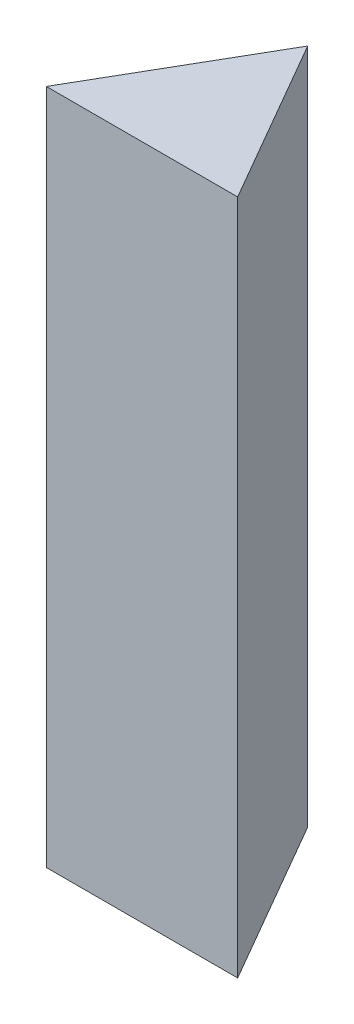
ISO-10303-21;
HEADER;
FILE_DESCRIPTION(('STEP AP214'),'2;1');
FILE_NAME('part.step','',(''),(''),'','','');
FILE_SCHEMA(('AUTOMOTIVE_DESIGN { 1 0 10303 214 1 1 1 1 }'));
ENDSEC;
DATA;
#1=APPLICATION_CONTEXT('core data for automotive mechanical design processes');
#2=APPLICATION_PROTOCOL_DEFINITION('international standard','automotive_design',2000,#1);
#3=PRODUCT_CONTEXT('',#1,'mechanical');
#4=PRODUCT('Part','Part','',(#3));
#5=PRODUCT_RELATED_PRODUCT_CATEGORY('part','',(#4));
#6=PRODUCT_DEFINITION_FORMATION('','',#4);
#7=PRODUCT_DEFINITION_CONTEXT('part definition',#1,'design');
#8=PRODUCT_DEFINITION('design','',#6,#7);
#9=PRODUCT_DEFINITION_SHAPE('','',#8);
#10=(LENGTH_UNIT() NAMED_UNIT(*) SI_UNIT(.MILLI.,.METRE.));
#11=(NAMED_UNIT(*) PLANE_ANGLE_UNIT() SI_UNIT($,.RADIAN.));
#12=(NAMED_UNIT(*) SI_UNIT($,.STERADIAN.) SOLID_ANGLE_UNIT());
#13=UNCERTAINTY_MEASURE_WITH_UNIT(LENGTH_MEASURE(1.E-05),#10,'distance_accuracy_value','');
#14=(GEOMETRIC_REPRESENTATION_CONTEXT(3) GLOBAL_UNCERTAINTY_ASSIGNED_CONTEXT((#13)) GLOBAL_UNIT_ASSIGNED_CONTEXT((#10,
#11,#12)) REPRESENTATION_CONTEXT('',''));
#15=CARTESIAN_POINT('',(0.,0.,0.));
#16=DIRECTION('',(0.,0.,1.));
#17=DIRECTION('',(1.,0.,0.));
#18=AXIS2_PLACEMENT_3D('',#15,#16,#17);
#19=CARTESIAN_POINT('',(0.,15.,1.22499999999998));
#20=DIRECTION('',(0.,0.,-1.));
#21=DIRECTION('',(-1.,0.,0.));
#22=AXIS2_PLACEMENT_3D('',#19,#20,#21);
#23=PLANE('',#22);
#24=DIRECTION('',(1.,0.,0.));
#25=VECTOR('',#24,1.);
#26=CARTESIAN_POINT('',(0.,0.,1.22499999999998));
#27=LINE('',#26,#25);
#28=CARTESIAN_POINT('',(-2.12176223927189,0.,1.22499999999998));
#29=VERTEX_POINT('',#28);
#30=CARTESIAN_POINT('',(2.12176223927189,0.,1.22499999999998));
#31=VERTEX_POINT('',#30);
#32=EDGE_CURVE('E82',#29,#31,#27,.T.);
#33=ORIENTED_EDGE('',*,*,#32,.T.);
#34=DIRECTION('',(0.,-1.,0.));
#35=VECTOR('',#34,1.);
#36=CARTESIAN_POINT('',(2.12176223927189,15.,1.22499999999998));
#37=LINE('',#36,#35);
#38=CARTESIAN_POINT('',(2.12176223927189,15.,1.22499999999998));
#39=VERTEX_POINT('',#38);
#40=EDGE_CURVE('E11',#39,#31,#37,.T.);
#41=ORIENTED_EDGE('',*,*,#40,.F.);
#42=DIRECTION('',(1.,0.,0.));
#43=VECTOR('',#42,1.);
#44=CARTESIAN_POINT('',(0.,15.,1.22499999999998));
#45=LINE('',#44,#43);
#46=CARTESIAN_POINT('',(-2.12176223927189,15.,1.22499999999998));
#47=VERTEX_POINT('',#46);
#48=EDGE_CURVE('E75',#47,#39,#45,.T.);
#49=ORIENTED_EDGE('',*,*,#48,.F.);
#50=DIRECTION('',(0.,-1.,0.));
#51=VECTOR('',#50,1.);
#52=CARTESIAN_POINT('',(-2.12176223927189,15.,1.22499999999998));
#53=LINE('',#52,#51);
#54=EDGE_CURVE('E83',#47,#29,#53,.T.);
#55=ORIENTED_EDGE('',*,*,#54,.T.);
#56=EDGE_LOOP('',(#33,#41,#49,#55));
#57=FACE_BOUND('',#56,.T.);
#58=ADVANCED_FACE('F35',(#57),#23,.F.);
#59=CARTESIAN_POINT('',(1.06088111963594,15.,-0.61250000000001));
#60=DIRECTION('',(-0.866025403784436,0.,0.500000000000004));
#61=DIRECTION('',(0.500000000000004,0.,0.866025403784436));
#62=AXIS2_PLACEMENT_3D('',#59,#60,#61);
#63=PLANE('',#62);
#64=DIRECTION('',(-0.500000000000004,0.,-0.866025403784436));
#65=VECTOR('',#64,1.);
#66=CARTESIAN_POINT('',(1.06088111963594,0.,-0.61250000000001));
#67=LINE('',#66,#65);
#68=CARTESIAN_POINT('',(0.,0.,-2.45));
#69=VERTEX_POINT('',#68);
#70=EDGE_CURVE('E63',#31,#69,#67,.T.);
#71=ORIENTED_EDGE('',*,*,#70,.T.);
#72=DIRECTION('',(0.,-1.,0.));
#73=VECTOR('',#72,1.);
#74=CARTESIAN_POINT('',(0.,15.,-2.45));
#75=LINE('',#74,#73);
#76=CARTESIAN_POINT('',(0.,15.,-2.45));
#77=VERTEX_POINT('',#76);
#78=EDGE_CURVE('E43',#77,#69,#75,.T.);
#79=ORIENTED_EDGE('',*,*,#78,.F.);
#80=DIRECTION('',(-0.500000000000004,0.,-0.866025403784436));
#81=VECTOR('',#80,1.);
#82=CARTESIAN_POINT('',(1.06088111963594,15.,-0.61250000000001));
#83=LINE('',#82,#81);
#84=EDGE_CURVE('E71',#39,#77,#83,.T.);
#85=ORIENTED_EDGE('',*,*,#84,.F.);
#86=ORIENTED_EDGE('',*,*,#40,.T.);
#87=EDGE_LOOP('',(#71,#79,#85,#86));
#88=FACE_BOUND('',#87,.T.);
#89=ADVANCED_FACE('F72',(#88),#63,.F.);
#90=CARTESIAN_POINT('',(-1.06088111963594,15.,-0.61250000000001));
#91=DIRECTION('',(0.866025403784436,0.,0.500000000000004));
#92=DIRECTION('',(0.500000000000004,0.,-0.866025403784436));
#93=AXIS2_PLACEMENT_3D('',#90,#91,#92);
#94=PLANE('',#93);
#95=DIRECTION('',(-0.500000000000004,0.,0.866025403784436));
#96=VECTOR('',#95,1.);
#97=CARTESIAN_POINT('',(-1.06088111963594,0.,-0.61250000000001));
#98=LINE('',#97,#96);
#99=EDGE_CURVE('E68',#69,#29,#98,.T.);
#100=ORIENTED_EDGE('',*,*,#99,.T.);
#101=ORIENTED_EDGE('',*,*,#54,.F.);
#102=DIRECTION('',(-0.500000000000004,0.,0.866025403784436));
#103=VECTOR('',#102,1.);
#104=CARTESIAN_POINT('',(-1.06088111963594,15.,-0.61250000000001));
#105=LINE('',#104,#103);
#106=EDGE_CURVE('E51',#77,#47,#105,.T.);
#107=ORIENTED_EDGE('',*,*,#106,.F.);
#108=ORIENTED_EDGE('',*,*,#78,.T.);
#109=EDGE_LOOP('',(#100,#101,#107,#108));
#110=FACE_BOUND('',#109,.T.);
#111=ADVANCED_FACE('F90',(#110),#94,.F.);
#112=CARTESIAN_POINT('',(0.,15.,0.));
#113=DIRECTION('',(0.,1.,0.));
#114=DIRECTION('',(0.,0.,1.));
#115=AXIS2_PLACEMENT_3D('',#112,#113,#114);
#116=PLANE('',#115);
#117=ORIENTED_EDGE('',*,*,#48,.T.);
#118=ORIENTED_EDGE('',*,*,#84,.T.);
#119=ORIENTED_EDGE('',*,*,#106,.T.);
#120=EDGE_LOOP('',(#117,#118,#119));
#121=FACE_BOUND('',#120,.T.);
#122=ADVANCED_FACE('F78',(#121),#116,.T.);
#123=CARTESIAN_POINT('',(0.,0.,0.));
#124=DIRECTION('',(0.,1.,0.));
#125=DIRECTION('',(0.,0.,1.));
#126=AXIS2_PLACEMENT_3D('',#123,#124,#125);
#127=PLANE('',#126);
#128=ORIENTED_EDGE('',*,*,#32,.F.);
#129=ORIENTED_EDGE('',*,*,#99,.F.);
#130=ORIENTED_EDGE('',*,*,#70,.F.);
#131=EDGE_LOOP('',(#128,#129,#130));
#132=FACE_BOUND('',#131,.T.);
#133=ADVANCED_FACE('F91',(#132),#127,.F.);
#134=CLOSED_SHELL('',(#58,#89,#111,#122,#133));
#135=MANIFOLD_SOLID_BREP('B2',#134);
#136=ADVANCED_BREP_SHAPE_REPRESENTATION('',(#18,#135),#14);
#137=SHAPE_DEFINITION_REPRESENTATION(#9,#136);
ENDSEC;
END-ISO-10303-21;
